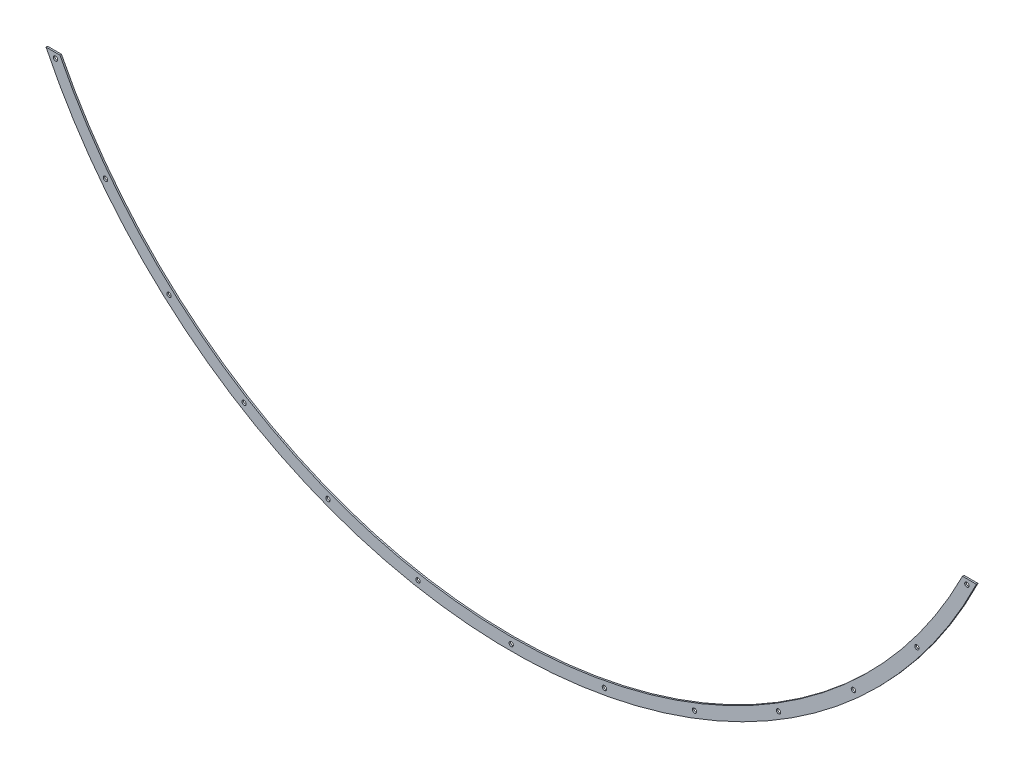
ISO-10303-21;
HEADER;
FILE_DESCRIPTION(('STEP AP214'),'2;1');
FILE_NAME('part.step','',(''),(''),'','','');
FILE_SCHEMA(('AUTOMOTIVE_DESIGN { 1 0 10303 214 1 1 1 1 }'));
ENDSEC;
DATA;
#1=APPLICATION_CONTEXT('core data for automotive mechanical design processes');
#2=APPLICATION_PROTOCOL_DEFINITION('international standard','automotive_design',2000,#1);
#3=PRODUCT_CONTEXT('',#1,'mechanical');
#4=PRODUCT('Part','Part','',(#3));
#5=PRODUCT_RELATED_PRODUCT_CATEGORY('part','',(#4));
#6=PRODUCT_DEFINITION_FORMATION('','',#4);
#7=PRODUCT_DEFINITION_CONTEXT('part definition',#1,'design');
#8=PRODUCT_DEFINITION('design','',#6,#7);
#9=PRODUCT_DEFINITION_SHAPE('','',#8);
#10=(LENGTH_UNIT() NAMED_UNIT(*) SI_UNIT(.MILLI.,.METRE.));
#11=(NAMED_UNIT(*) PLANE_ANGLE_UNIT() SI_UNIT($,.RADIAN.));
#12=(NAMED_UNIT(*) SI_UNIT($,.STERADIAN.) SOLID_ANGLE_UNIT());
#13=UNCERTAINTY_MEASURE_WITH_UNIT(LENGTH_MEASURE(1.E-05),#10,'distance_accuracy_value','');
#14=(GEOMETRIC_REPRESENTATION_CONTEXT(3) GLOBAL_UNCERTAINTY_ASSIGNED_CONTEXT((#13)) GLOBAL_UNIT_ASSIGNED_CONTEXT((#10,
#11,#12)) REPRESENTATION_CONTEXT('',''));
#15=CARTESIAN_POINT('',(0.,0.,0.));
#16=DIRECTION('',(0.,0.,1.));
#17=DIRECTION('',(1.,0.,0.));
#18=AXIS2_PLACEMENT_3D('',#15,#16,#17);
#19=CARTESIAN_POINT('',(0.,-364.000000000005,-1.11022302462516E-13));
#20=DIRECTION('',(0.,-1.00000000000001,0.));
#21=DIRECTION('',(1.,0.,0.));
#22=AXIS2_PLACEMENT_3D('',#19,#20,#21);
#23=PLANE('',#22);
#24=DIRECTION('',(0.,0.,1.00000000000001));
#25=VECTOR('',#24,1.);
#26=CARTESIAN_POINT('',(723.604864549705,-364.000000000005,-10.0000000000003));
#27=LINE('',#26,#25);
#28=CARTESIAN_POINT('',(723.604864549705,-364.000000000005,-1.66533453693773E-13));
#29=VERTEX_POINT('',#28);
#30=CARTESIAN_POINT('',(723.604864549705,-364.000000000004,-2.50000000000034));
#31=VERTEX_POINT('',#30);
#32=EDGE_CURVE('E11',#29,#31,#27,.F.);
#33=ORIENTED_EDGE('',*,*,#32,.F.);
#34=DIRECTION('',(1.,0.,0.));
#35=VECTOR('',#34,1.);
#36=CARTESIAN_POINT('',(0.,-364.000000000005,-1.11022302462516E-13));
#37=LINE('',#36,#35);
#38=CARTESIAN_POINT('',(745.924929198641,-364.000000000004,-4.9960036108132E-13));
#39=VERTEX_POINT('',#38);
#40=EDGE_CURVE('E89',#29,#39,#37,.T.);
#41=ORIENTED_EDGE('',*,*,#40,.T.);
#42=DIRECTION('',(0.,0.,1.00000000000001));
#43=VECTOR('',#42,1.);
#44=CARTESIAN_POINT('',(745.924929198641,-364.000000000004,-4.9960036108132E-13));
#45=LINE('',#44,#43);
#46=CARTESIAN_POINT('',(745.924929198641,-364.000000000004,-2.50000000000072));
#47=VERTEX_POINT('',#46);
#48=EDGE_CURVE('E109',#39,#47,#45,.F.);
#49=ORIENTED_EDGE('',*,*,#48,.T.);
#50=DIRECTION('',(1.,0.,0.));
#51=VECTOR('',#50,1.);
#52=CARTESIAN_POINT('',(0.,-364.000000000005,-2.50000000000028));
#53=LINE('',#52,#51);
#54=EDGE_CURVE('E91',#31,#47,#53,.T.);
#55=ORIENTED_EDGE('',*,*,#54,.F.);
#56=EDGE_LOOP('',(#33,#41,#49,#55));
#57=FACE_BOUND('',#56,.T.);
#58=ADVANCED_FACE('F38',(#57),#23,.F.);
#59=CARTESIAN_POINT('',(0.,-1.66533453693773E-13,-2.49999999999972));
#60=DIRECTION('',(0.,0.,1.00000000000001));
#61=DIRECTION('',(1.,0.,0.));
#62=AXIS2_PLACEMENT_3D('',#59,#60,#61);
#63=CYLINDRICAL_SURFACE('',#62,830.);
#64=CARTESIAN_POINT('',(0.,-1.66533453693773E-13,-2.49999999999972));
#65=DIRECTION('',(0.,0.,1.00000000000001));
#66=DIRECTION('',(1.,0.,0.));
#67=AXIS2_PLACEMENT_3D('',#64,#65,#66);
#68=CIRCLE('',#67,830.);
#69=CARTESIAN_POINT('',(-745.924929198645,-364.000000000005,-2.49999999999972));
#70=VERTEX_POINT('',#69);
#71=EDGE_CURVE('E120',#70,#47,#68,.T.);
#72=ORIENTED_EDGE('',*,*,#71,.T.);
#73=ORIENTED_EDGE('',*,*,#48,.F.);
#74=CARTESIAN_POINT('',(0.,0.,0.));
#75=DIRECTION('',(0.,0.,1.00000000000001));
#76=DIRECTION('',(1.,0.,0.));
#77=AXIS2_PLACEMENT_3D('',#74,#75,#76);
#78=CIRCLE('',#77,830.);
#79=CARTESIAN_POINT('',(-745.924929198645,-364.000000000005,2.22044604925031E-13));
#80=VERTEX_POINT('',#79);
#81=EDGE_CURVE('E95',#80,#39,#78,.T.);
#82=ORIENTED_EDGE('',*,*,#81,.F.);
#83=DIRECTION('',(0.,0.,1.00000000000001));
#84=VECTOR('',#83,1.);
#85=CARTESIAN_POINT('',(-745.924929198645,-364.000000000005,2.22044604925031E-13));
#86=LINE('',#85,#84);
#87=EDGE_CURVE('E62',#80,#70,#86,.F.);
#88=ORIENTED_EDGE('',*,*,#87,.T.);
#89=EDGE_LOOP('',(#72,#73,#82,#88));
#90=FACE_BOUND('',#89,.T.);
#91=ADVANCED_FACE('F40',(#90),#63,.T.);
#92=CARTESIAN_POINT('',(0.,-1.66533453693773E-13,-2.49999999999972));
#93=DIRECTION('',(0.,0.,1.00000000000001));
#94=DIRECTION('',(1.,0.,0.));
#95=AXIS2_PLACEMENT_3D('',#92,#93,#94);
#96=PLANE('',#95);
#97=CARTESIAN_POINT('',(293.861718627147,-765.535949727714,-2.5000000000005));
#98=DIRECTION('',(0.,0.,-1.00000000000001));
#99=DIRECTION('',(-0.933580426497203,-0.358367949545305,0.));
#100=AXIS2_PLACEMENT_3D('',#97,#98,#99);
#101=CIRCLE('',#100,3.50000000000001);
#102=CARTESIAN_POINT('',(290.594187134407,-766.790237551122,-2.5000000000005));
#103=VERTEX_POINT('',#102);
#104=EDGE_CURVE('E136',#103,#103,#101,.T.);
#105=ORIENTED_EDGE('',*,*,#104,.F.);
#106=EDGE_LOOP('',(#105));
#107=FACE_BOUND('',#106,.T.);
#108=CARTESIAN_POINT('',(428.448823067079,-699.164934770364,-2.50000000000039));
#109=DIRECTION('',(0.,0.,-1.00000000000001));
#110=DIRECTION('',(-0.852640164354092,-0.522498564715955,0.));
#111=AXIS2_PLACEMENT_3D('',#108,#109,#110);
#112=CIRCLE('',#111,3.50000000000001);
#113=CARTESIAN_POINT('',(425.46458249184,-700.99367974687,-2.50000000000039));
#114=VERTEX_POINT('',#113);
#115=EDGE_CURVE('E164',#114,#114,#112,.T.);
#116=ORIENTED_EDGE('',*,*,#115,.F.);
#117=EDGE_LOOP('',(#116));
#118=FACE_BOUND('',#117,.T.);
#119=CARTESIAN_POINT('',(548.687097214264,-609.378756891469,-2.49999999999972));
#120=DIRECTION('',(0.,0.,-1.00000000000001));
#121=DIRECTION('',(-0.743144825477393,-0.669130606358868,0.));
#122=AXIS2_PLACEMENT_3D('',#119,#120,#121);
#123=CIRCLE('',#122,3.50000000000001);
#124=CARTESIAN_POINT('',(546.086090325093,-611.720714013725,-2.49999999999973));
#125=VERTEX_POINT('',#124);
#126=EDGE_CURVE('E161',#125,#125,#123,.T.);
#127=ORIENTED_EDGE('',*,*,#126,.F.);
#128=EDGE_LOOP('',(#127));
#129=FACE_BOUND('',#128,.T.);
#130=CARTESIAN_POINT('',(650.549739038815,-499.184371787156,-2.50000000000017));
#131=DIRECTION('',(0.,0.,-1.00000000000001));
#132=DIRECTION('',(-0.60876142900872,-0.793353340291246,0.));
#133=AXIS2_PLACEMENT_3D('',#130,#131,#132);
#134=CIRCLE('',#133,3.50000000000001);
#135=CARTESIAN_POINT('',(648.419074037284,-501.961108478176,-2.50000000000017));
#136=VERTEX_POINT('',#135);
#137=EDGE_CURVE('E158',#136,#136,#134,.T.);
#138=ORIENTED_EDGE('',*,*,#137,.F.);
#139=EDGE_LOOP('',(#138));
#140=FACE_BOUND('',#139,.T.);
#141=CARTESIAN_POINT('',(730.62534983446,-372.272209786432,-2.50000000000045));
#142=DIRECTION('',(0.,0.,-1.00000000000001));
#143=DIRECTION('',(-0.453990499739545,-0.891006524188379,0.));
#144=AXIS2_PLACEMENT_3D('',#141,#142,#143);
#145=CIRCLE('',#144,3.50000000000001);
#146=CARTESIAN_POINT('',(729.036383085372,-375.390732621091,-2.50000000000045));
#147=VERTEX_POINT('',#146);
#148=EDGE_CURVE('E155',#147,#147,#145,.T.);
#149=ORIENTED_EDGE('',*,*,#148,.F.);
#150=EDGE_LOOP('',(#149));
#151=FACE_BOUND('',#150,.T.);
#152=CARTESIAN_POINT('',(-149.433130903561,-806.269024202452,-2.50000000000111));
#153=DIRECTION('',(0.,0.,-1.00000000000001));
#154=DIRECTION('',(-0.983254907563953,0.18223552549215,0.));
#155=AXIS2_PLACEMENT_3D('',#152,#153,#154);
#156=CIRCLE('',#155,3.50000000000001);
#157=CARTESIAN_POINT('',(-152.874523080035,-805.63119986323,-2.50000000000111));
#158=VERTEX_POINT('',#157);
#159=EDGE_CURVE('E152',#158,#158,#156,.T.);
#160=ORIENTED_EDGE('',*,*,#159,.F.);
#161=EDGE_LOOP('',(#160));
#162=FACE_BOUND('',#161,.T.);
#163=CARTESIAN_POINT('',(-293.861718627147,-765.535949727713,-2.50000000000022));
#164=DIRECTION('',(0.,0.,-1.00000000000001));
#165=DIRECTION('',(-0.9335804264972,0.358367949545305,0.));
#166=AXIS2_PLACEMENT_3D('',#163,#164,#165);
#167=CIRCLE('',#166,3.50000000000001);
#168=CARTESIAN_POINT('',(-297.129250119887,-764.281661904305,-2.50000000000022));
#169=VERTEX_POINT('',#168);
#170=EDGE_CURVE('E149',#169,#169,#167,.T.);
#171=ORIENTED_EDGE('',*,*,#170,.F.);
#172=EDGE_LOOP('',(#171));
#173=FACE_BOUND('',#172,.T.);
#174=CARTESIAN_POINT('',(-428.448823067078,-699.164934770364,-2.49999999999967));
#175=DIRECTION('',(0.,0.,-1.00000000000001));
#176=DIRECTION('',(-0.852640164354092,0.522498564715957,0.));
#177=AXIS2_PLACEMENT_3D('',#174,#175,#176);
#178=CIRCLE('',#177,3.50000000000001);
#179=CARTESIAN_POINT('',(-431.433063642318,-697.336189793858,-2.49999999999967));
#180=VERTEX_POINT('',#179);
#181=EDGE_CURVE('E146',#180,#180,#178,.T.);
#182=ORIENTED_EDGE('',*,*,#181,.F.);
#183=EDGE_LOOP('',(#182));
#184=FACE_BOUND('',#183,.T.);
#185=CARTESIAN_POINT('',(-548.687097214266,-609.378756891471,-2.5000000000005));
#186=DIRECTION('',(0.,0.,-1.00000000000001));
#187=DIRECTION('',(-0.743144825477393,0.669130606358868,0.));
#188=AXIS2_PLACEMENT_3D('',#185,#186,#187);
#189=CIRCLE('',#188,3.50000000000001);
#190=CARTESIAN_POINT('',(-551.288104103436,-607.036799769215,-2.5000000000005));
#191=VERTEX_POINT('',#190);
#192=EDGE_CURVE('E143',#191,#191,#189,.T.);
#193=ORIENTED_EDGE('',*,*,#192,.F.);
#194=EDGE_LOOP('',(#193));
#195=FACE_BOUND('',#194,.T.);
#196=CARTESIAN_POINT('',(-650.549739038813,-499.184371787157,-2.49999999999972));
#197=DIRECTION('',(0.,0.,-1.00000000000001));
#198=DIRECTION('',(-0.608761429008718,0.793353340291247,0.));
#199=AXIS2_PLACEMENT_3D('',#196,#197,#198);
#200=CIRCLE('',#199,3.50000000000001);
#201=CARTESIAN_POINT('',(-652.680404040344,-496.407635096138,-2.49999999999973));
#202=VERTEX_POINT('',#201);
#203=EDGE_CURVE('E140',#202,#202,#200,.T.);
#204=ORIENTED_EDGE('',*,*,#203,.F.);
#205=EDGE_LOOP('',(#204));
#206=FACE_BOUND('',#205,.T.);
#207=CARTESIAN_POINT('',(-730.625349834465,-372.272209786431,-2.50000000000106));
#208=DIRECTION('',(0.,0.,-1.00000000000001));
#209=DIRECTION('',(-0.453990499739545,0.89100652418838,0.));
#210=AXIS2_PLACEMENT_3D('',#207,#208,#209);
#211=CIRCLE('',#210,3.50000000000001);
#212=CARTESIAN_POINT('',(-732.214316583554,-369.153686951772,-2.50000000000106));
#213=VERTEX_POINT('',#212);
#214=EDGE_CURVE('E137',#213,#213,#211,.T.);
#215=ORIENTED_EDGE('',*,*,#214,.F.);
#216=EDGE_LOOP('',(#215));
#217=FACE_BOUND('',#216,.T.);
#218=CARTESIAN_POINT('',(149.433130903562,-806.269024202452,-2.49999999999961));
#219=DIRECTION('',(0.,0.,-1.00000000000001));
#220=DIRECTION('',(-0.983254907563956,-0.18223552549215,0.));
#221=AXIS2_PLACEMENT_3D('',#218,#219,#220);
#222=CIRCLE('',#221,3.50000000000001);
#223=CARTESIAN_POINT('',(145.991738727088,-806.906848541675,-2.49999999999961));
#224=VERTEX_POINT('',#223);
#225=EDGE_CURVE('E132',#224,#224,#222,.T.);
#226=ORIENTED_EDGE('',*,*,#225,.F.);
#227=EDGE_LOOP('',(#226));
#228=FACE_BOUND('',#227,.T.);
#229=CARTESIAN_POINT('',(1.73472347597681E-13,-820.00000000001,-2.50000000000017));
#230=DIRECTION('',(0.,0.,-1.00000000000001));
#231=DIRECTION('',(-1.,0.,0.));
#232=AXIS2_PLACEMENT_3D('',#229,#230,#231);
#233=CIRCLE('',#232,3.50000000000001);
#234=CARTESIAN_POINT('',(-3.49999999999983,-820.00000000001,-2.50000000000017));
#235=VERTEX_POINT('',#234);
#236=EDGE_CURVE('E129',#235,#235,#233,.T.);
#237=ORIENTED_EDGE('',*,*,#236,.F.);
#238=EDGE_LOOP('',(#237));
#239=FACE_BOUND('',#238,.T.);
#240=CARTESIAN_POINT('',(-723.604864549709,-364.000000000005,-2.50000000000117));
#241=VERTEX_POINT('',#240);
#242=EDGE_CURVE('E113',#70,#241,#53,.T.);
#243=ORIENTED_EDGE('',*,*,#242,.T.);
#244=CARTESIAN_POINT('',(0.,-1.66533453693773E-13,-2.49999999999972));
#245=DIRECTION('',(0.,0.,1.00000000000001));
#246=DIRECTION('',(1.,0.,0.));
#247=AXIS2_PLACEMENT_3D('',#244,#245,#246);
#248=CIRCLE('',#247,810.);
#249=EDGE_CURVE('E54',#241,#31,#248,.T.);
#250=ORIENTED_EDGE('',*,*,#249,.T.);
#251=ORIENTED_EDGE('',*,*,#54,.T.);
#252=ORIENTED_EDGE('',*,*,#71,.F.);
#253=EDGE_LOOP('',(#243,#250,#251,#252));
#254=FACE_BOUND('',#253,.T.);
#255=ADVANCED_FACE('F118',(#107,#118,#129,#140,#151,#162,#173,#184,#195,#206,#217,#228,#239,
#254),#96,.F.);
#256=CARTESIAN_POINT('',(0.,0.,0.));
#257=DIRECTION('',(0.,0.,1.00000000000001));
#258=DIRECTION('',(1.,0.,0.));
#259=AXIS2_PLACEMENT_3D('',#256,#257,#258);
#260=PLANE('',#259);
#261=CARTESIAN_POINT('',(293.861718627147,-765.535949727715,-3.33066907387547E-13));
#262=DIRECTION('',(0.,0.,1.00000000000001));
#263=DIRECTION('',(1.,0.,0.));
#264=AXIS2_PLACEMENT_3D('',#261,#262,#263);
#265=CIRCLE('',#264,3.50000000000001);
#266=CARTESIAN_POINT('',(297.361718627147,-765.535949727715,-3.33066907387547E-13));
#267=VERTEX_POINT('',#266);
#268=EDGE_CURVE('E42',#267,#267,#265,.T.);
#269=ORIENTED_EDGE('',*,*,#268,.F.);
#270=EDGE_LOOP('',(#269));
#271=FACE_BOUND('',#270,.T.);
#272=CARTESIAN_POINT('',(428.448823067079,-699.164934770365,-2.22044604925031E-13));
#273=DIRECTION('',(0.,0.,1.00000000000001));
#274=DIRECTION('',(1.,0.,0.));
#275=AXIS2_PLACEMENT_3D('',#272,#273,#274);
#276=CIRCLE('',#275,3.50000000000001);
#277=CARTESIAN_POINT('',(431.948823067079,-699.164934770365,-2.22044604925031E-13));
#278=VERTEX_POINT('',#277);
#279=EDGE_CURVE('E232',#278,#278,#276,.T.);
#280=ORIENTED_EDGE('',*,*,#279,.F.);
#281=EDGE_LOOP('',(#280));
#282=FACE_BOUND('',#281,.T.);
#283=CARTESIAN_POINT('',(548.687097214264,-609.378756891471,-2.22044604925031E-13));
#284=DIRECTION('',(0.,0.,1.00000000000001));
#285=DIRECTION('',(1.,0.,0.));
#286=AXIS2_PLACEMENT_3D('',#283,#284,#285);
#287=CIRCLE('',#286,3.50000000000001);
#288=CARTESIAN_POINT('',(552.187097214264,-609.378756891471,-2.22044604925031E-13));
#289=VERTEX_POINT('',#288);
#290=EDGE_CURVE('E236',#289,#289,#287,.T.);
#291=ORIENTED_EDGE('',*,*,#290,.F.);
#292=EDGE_LOOP('',(#291));
#293=FACE_BOUND('',#292,.T.);
#294=CARTESIAN_POINT('',(650.549739038815,-499.184371787156,-1.66533453693773E-13));
#295=DIRECTION('',(0.,0.,1.00000000000001));
#296=DIRECTION('',(1.,0.,0.));
#297=AXIS2_PLACEMENT_3D('',#294,#295,#296);
#298=CIRCLE('',#297,3.50000000000001);
#299=CARTESIAN_POINT('',(654.049739038815,-499.184371787156,-1.66533453693773E-13));
#300=VERTEX_POINT('',#299);
#301=EDGE_CURVE('E240',#300,#300,#298,.T.);
#302=ORIENTED_EDGE('',*,*,#301,.F.);
#303=EDGE_LOOP('',(#302));
#304=FACE_BOUND('',#303,.T.);
#305=CARTESIAN_POINT('',(730.62534983446,-372.272209786432,-6.10622663543836E-13));
#306=DIRECTION('',(0.,0.,1.00000000000001));
#307=DIRECTION('',(1.,0.,0.));
#308=AXIS2_PLACEMENT_3D('',#305,#306,#307);
#309=CIRCLE('',#308,3.50000000000001);
#310=CARTESIAN_POINT('',(734.12534983446,-372.272209786432,-6.10622663543836E-13));
#311=VERTEX_POINT('',#310);
#312=EDGE_CURVE('E244',#311,#311,#309,.T.);
#313=ORIENTED_EDGE('',*,*,#312,.F.);
#314=EDGE_LOOP('',(#313));
#315=FACE_BOUND('',#314,.T.);
#316=CARTESIAN_POINT('',(-149.433130903561,-806.269024202453,-1.22124532708767E-12));
#317=DIRECTION('',(0.,0.,1.00000000000001));
#318=DIRECTION('',(1.,0.,0.));
#319=AXIS2_PLACEMENT_3D('',#316,#317,#318);
#320=CIRCLE('',#319,3.50000000000001);
#321=CARTESIAN_POINT('',(-145.933130903561,-806.269024202453,-1.22124532708767E-12));
#322=VERTEX_POINT('',#321);
#323=EDGE_CURVE('E248',#322,#322,#320,.T.);
#324=ORIENTED_EDGE('',*,*,#323,.F.);
#325=EDGE_LOOP('',(#324));
#326=FACE_BOUND('',#325,.T.);
#327=CARTESIAN_POINT('',(-293.861718627147,-765.535949727714,9.99200722162641E-13));
#328=DIRECTION('',(0.,0.,1.00000000000001));
#329=DIRECTION('',(1.,0.,0.));
#330=AXIS2_PLACEMENT_3D('',#327,#328,#329);
#331=CIRCLE('',#330,3.50000000000001);
#332=CARTESIAN_POINT('',(-290.361718627147,-765.535949727714,9.99200722162641E-13));
#333=VERTEX_POINT('',#332);
#334=EDGE_CURVE('E252',#333,#333,#331,.T.);
#335=ORIENTED_EDGE('',*,*,#334,.F.);
#336=EDGE_LOOP('',(#335));
#337=FACE_BOUND('',#336,.T.);
#338=CARTESIAN_POINT('',(-428.448823067079,-699.164934770364,-2.77555756156289E-13));
#339=DIRECTION('',(0.,0.,1.00000000000001));
#340=DIRECTION('',(1.,0.,0.));
#341=AXIS2_PLACEMENT_3D('',#338,#339,#340);
#342=CIRCLE('',#341,3.50000000000001);
#343=CARTESIAN_POINT('',(-424.948823067079,-699.164934770364,-2.77555756156289E-13));
#344=VERTEX_POINT('',#343);
#345=EDGE_CURVE('E256',#344,#344,#342,.T.);
#346=ORIENTED_EDGE('',*,*,#345,.F.);
#347=EDGE_LOOP('',(#346));
#348=FACE_BOUND('',#347,.T.);
#349=CARTESIAN_POINT('',(-548.687097214265,-609.37875689147,-6.10622663543836E-13));
#350=DIRECTION('',(0.,0.,1.00000000000001));
#351=DIRECTION('',(1.,0.,0.));
#352=AXIS2_PLACEMENT_3D('',#349,#350,#351);
#353=CIRCLE('',#352,3.50000000000001);
#354=CARTESIAN_POINT('',(-545.187097214265,-609.37875689147,-6.10622663543836E-13));
#355=VERTEX_POINT('',#354);
#356=EDGE_CURVE('E260',#355,#355,#353,.T.);
#357=ORIENTED_EDGE('',*,*,#356,.F.);
#358=EDGE_LOOP('',(#357));
#359=FACE_BOUND('',#358,.T.);
#360=CARTESIAN_POINT('',(-650.549739038813,-499.184371787158,2.22044604925031E-13));
#361=DIRECTION('',(0.,0.,1.00000000000001));
#362=DIRECTION('',(1.,0.,0.));
#363=AXIS2_PLACEMENT_3D('',#360,#361,#362);
#364=CIRCLE('',#363,3.50000000000001);
#365=CARTESIAN_POINT('',(-647.049739038813,-499.184371787158,2.22044604925031E-13));
#366=VERTEX_POINT('',#365);
#367=EDGE_CURVE('E264',#366,#366,#364,.T.);
#368=ORIENTED_EDGE('',*,*,#367,.F.);
#369=EDGE_LOOP('',(#368));
#370=FACE_BOUND('',#369,.T.);
#371=CARTESIAN_POINT('',(-730.625349834465,-372.272209786431,1.11022302462516E-13));
#372=DIRECTION('',(0.,0.,1.00000000000001));
#373=DIRECTION('',(1.,0.,0.));
#374=AXIS2_PLACEMENT_3D('',#371,#372,#373);
#375=CIRCLE('',#374,3.50000000000001);
#376=CARTESIAN_POINT('',(-727.125349834465,-372.272209786431,1.11022302462516E-13));
#377=VERTEX_POINT('',#376);
#378=EDGE_CURVE('E268',#377,#377,#375,.T.);
#379=ORIENTED_EDGE('',*,*,#378,.F.);
#380=EDGE_LOOP('',(#379));
#381=FACE_BOUND('',#380,.T.);
#382=CARTESIAN_POINT('',(149.433130903561,-806.269024202453,1.22124532708767E-12));
#383=DIRECTION('',(0.,0.,1.00000000000001));
#384=DIRECTION('',(1.,0.,0.));
#385=AXIS2_PLACEMENT_3D('',#382,#383,#384);
#386=CIRCLE('',#385,3.50000000000001);
#387=CARTESIAN_POINT('',(152.933130903561,-806.269024202453,1.22124532708767E-12));
#388=VERTEX_POINT('',#387);
#389=EDGE_CURVE('E135',#388,#388,#386,.T.);
#390=ORIENTED_EDGE('',*,*,#389,.F.);
#391=EDGE_LOOP('',(#390));
#392=FACE_BOUND('',#391,.T.);
#393=CARTESIAN_POINT('',(1.40512601554121E-13,-820.00000000001,1.11022302462516E-13));
#394=DIRECTION('',(0.,0.,1.00000000000001));
#395=DIRECTION('',(1.,0.,0.));
#396=AXIS2_PLACEMENT_3D('',#393,#394,#395);
#397=CIRCLE('',#396,3.50000000000001);
#398=CARTESIAN_POINT('',(3.50000000000015,-820.00000000001,1.11022302462516E-13));
#399=VERTEX_POINT('',#398);
#400=EDGE_CURVE('E84',#399,#399,#397,.T.);
#401=ORIENTED_EDGE('',*,*,#400,.F.);
#402=EDGE_LOOP('',(#401));
#403=FACE_BOUND('',#402,.T.);
#404=CARTESIAN_POINT('',(0.,0.,0.));
#405=DIRECTION('',(0.,0.,1.00000000000001));
#406=DIRECTION('',(1.,0.,0.));
#407=AXIS2_PLACEMENT_3D('',#404,#405,#406);
#408=CIRCLE('',#407,810.);
#409=CARTESIAN_POINT('',(-723.604864549709,-364.000000000006,-6.66133814775094E-13));
#410=VERTEX_POINT('',#409);
#411=EDGE_CURVE('E79',#410,#29,#408,.T.);
#412=ORIENTED_EDGE('',*,*,#411,.F.);
#413=EDGE_CURVE('E96',#80,#410,#37,.T.);
#414=ORIENTED_EDGE('',*,*,#413,.F.);
#415=ORIENTED_EDGE('',*,*,#81,.T.);
#416=ORIENTED_EDGE('',*,*,#40,.F.);
#417=EDGE_LOOP('',(#412,#414,#415,#416));
#418=FACE_BOUND('',#417,.T.);
#419=ADVANCED_FACE('F93',(#271,#282,#293,#304,#315,#326,#337,#348,#359,#370,#381,#392,#403,
#418),#260,.T.);
#420=DIRECTION('',(0.,0.,1.00000000000001));
#421=VECTOR('',#420,1.);
#422=CARTESIAN_POINT('',(-723.60486454971,-364.000000000005,-10.0000000000008));
#423=LINE('',#422,#421);
#424=EDGE_CURVE('E47',#241,#410,#423,.T.);
#425=ORIENTED_EDGE('',*,*,#424,.F.);
#426=ORIENTED_EDGE('',*,*,#242,.F.);
#427=ORIENTED_EDGE('',*,*,#87,.F.);
#428=ORIENTED_EDGE('',*,*,#413,.T.);
#429=EDGE_LOOP('',(#425,#426,#427,#428));
#430=FACE_BOUND('',#429,.T.);
#431=ADVANCED_FACE('F211',(#430),#23,.F.);
#432=CARTESIAN_POINT('',(0.,-6.38378239159465E-13,-10.0000000000003));
#433=DIRECTION('',(0.,0.,1.00000000000001));
#434=DIRECTION('',(1.,0.,0.));
#435=AXIS2_PLACEMENT_3D('',#432,#433,#434);
#436=CYLINDRICAL_SURFACE('',#435,810.);
#437=ORIENTED_EDGE('',*,*,#424,.T.);
#438=ORIENTED_EDGE('',*,*,#411,.T.);
#439=ORIENTED_EDGE('',*,*,#32,.T.);
#440=ORIENTED_EDGE('',*,*,#249,.F.);
#441=EDGE_LOOP('',(#437,#438,#439,#440));
#442=FACE_BOUND('',#441,.T.);
#443=ADVANCED_FACE('F81',(#442),#436,.F.);
#444=CARTESIAN_POINT('',(1.52655665885959E-13,-820.00000000001,7.50000000000006));
#445=DIRECTION('',(0.,0.,-1.00000000000001));
#446=DIRECTION('',(-1.,0.,0.));
#447=AXIS2_PLACEMENT_3D('',#444,#445,#446);
#448=CYLINDRICAL_SURFACE('',#447,3.50000000000001);
#449=ORIENTED_EDGE('',*,*,#400,.T.);
#450=EDGE_LOOP('',(#449));
#451=FACE_BOUND('',#450,.T.);
#452=ORIENTED_EDGE('',*,*,#236,.T.);
#453=EDGE_LOOP('',(#452));
#454=FACE_BOUND('',#453,.T.);
#455=ADVANCED_FACE('F199',(#451,#454),#448,.F.);
#456=CARTESIAN_POINT('',(149.433130903561,-806.269024202453,7.5000000000004));
#457=DIRECTION('',(0.,0.,-1.00000000000001));
#458=DIRECTION('',(-1.,0.,0.));
#459=AXIS2_PLACEMENT_3D('',#456,#457,#458);
#460=CYLINDRICAL_SURFACE('',#459,3.50000000000001);
#461=ORIENTED_EDGE('',*,*,#389,.T.);
#462=EDGE_LOOP('',(#461));
#463=FACE_BOUND('',#462,.T.);
#464=ORIENTED_EDGE('',*,*,#225,.T.);
#465=EDGE_LOOP('',(#464));
#466=FACE_BOUND('',#465,.T.);
#467=ADVANCED_FACE('F201',(#463,#466),#460,.F.);
#468=CARTESIAN_POINT('',(-730.625349834465,-372.272209786431,7.49999999999951));
#469=DIRECTION('',(0.,0.,-1.00000000000001));
#470=DIRECTION('',(-1.,0.,0.));
#471=AXIS2_PLACEMENT_3D('',#468,#469,#470);
#472=CYLINDRICAL_SURFACE('',#471,3.50000000000001);
#473=ORIENTED_EDGE('',*,*,#378,.T.);
#474=EDGE_LOOP('',(#473));
#475=FACE_BOUND('',#474,.T.);
#476=ORIENTED_EDGE('',*,*,#214,.T.);
#477=EDGE_LOOP('',(#476));
#478=FACE_BOUND('',#477,.T.);
#479=ADVANCED_FACE('F208',(#475,#478),#472,.F.);
#480=CARTESIAN_POINT('',(-650.549739038813,-499.184371787157,7.50000000000001));
#481=DIRECTION('',(0.,0.,-1.00000000000001));
#482=DIRECTION('',(-1.,0.,0.));
#483=AXIS2_PLACEMENT_3D('',#480,#481,#482);
#484=CYLINDRICAL_SURFACE('',#483,3.50000000000001);
#485=ORIENTED_EDGE('',*,*,#367,.T.);
#486=EDGE_LOOP('',(#485));
#487=FACE_BOUND('',#486,.T.);
#488=ORIENTED_EDGE('',*,*,#203,.T.);
#489=EDGE_LOOP('',(#488));
#490=FACE_BOUND('',#489,.T.);
#491=ADVANCED_FACE('F321',(#487,#490),#484,.F.);
#492=CARTESIAN_POINT('',(-548.687097214265,-609.378756891471,7.49999999999973));
#493=DIRECTION('',(0.,0.,-1.00000000000001));
#494=DIRECTION('',(-1.,0.,0.));
#495=AXIS2_PLACEMENT_3D('',#492,#493,#494);
#496=CYLINDRICAL_SURFACE('',#495,3.50000000000001);
#497=ORIENTED_EDGE('',*,*,#356,.T.);
#498=EDGE_LOOP('',(#497));
#499=FACE_BOUND('',#498,.T.);
#500=ORIENTED_EDGE('',*,*,#192,.T.);
#501=EDGE_LOOP('',(#500));
#502=FACE_BOUND('',#501,.T.);
#503=ADVANCED_FACE('F317',(#499,#502),#496,.F.);
#504=CARTESIAN_POINT('',(-428.448823067079,-699.164934770366,7.50000000000051));
#505=DIRECTION('',(0.,0.,-1.00000000000001));
#506=DIRECTION('',(-1.,0.,0.));
#507=AXIS2_PLACEMENT_3D('',#504,#505,#506);
#508=CYLINDRICAL_SURFACE('',#507,3.50000000000001);
#509=ORIENTED_EDGE('',*,*,#345,.T.);
#510=EDGE_LOOP('',(#509));
#511=FACE_BOUND('',#510,.T.);
#512=ORIENTED_EDGE('',*,*,#181,.T.);
#513=EDGE_LOOP('',(#512));
#514=FACE_BOUND('',#513,.T.);
#515=ADVANCED_FACE('F313',(#511,#514),#508,.F.);
#516=CARTESIAN_POINT('',(-293.861718627147,-765.535949727714,7.50000000000051));
#517=DIRECTION('',(0.,0.,-1.00000000000001));
#518=DIRECTION('',(-1.,0.,0.));
#519=AXIS2_PLACEMENT_3D('',#516,#517,#518);
#520=CYLINDRICAL_SURFACE('',#519,3.50000000000001);
#521=ORIENTED_EDGE('',*,*,#334,.T.);
#522=EDGE_LOOP('',(#521));
#523=FACE_BOUND('',#522,.T.);
#524=ORIENTED_EDGE('',*,*,#170,.T.);
#525=EDGE_LOOP('',(#524));
#526=FACE_BOUND('',#525,.T.);
#527=ADVANCED_FACE('F309',(#523,#526),#520,.F.);
#528=CARTESIAN_POINT('',(-149.433130903561,-806.269024202453,7.49999999999884));
#529=DIRECTION('',(0.,0.,-1.00000000000001));
#530=DIRECTION('',(-1.,0.,0.));
#531=AXIS2_PLACEMENT_3D('',#528,#529,#530);
#532=CYLINDRICAL_SURFACE('',#531,3.50000000000001);
#533=ORIENTED_EDGE('',*,*,#323,.T.);
#534=EDGE_LOOP('',(#533));
#535=FACE_BOUND('',#534,.T.);
#536=ORIENTED_EDGE('',*,*,#159,.T.);
#537=EDGE_LOOP('',(#536));
#538=FACE_BOUND('',#537,.T.);
#539=ADVANCED_FACE('F305',(#535,#538),#532,.F.);
#540=CARTESIAN_POINT('',(730.62534983446,-372.272209786432,7.49999999999951));
#541=DIRECTION('',(0.,0.,-1.00000000000001));
#542=DIRECTION('',(-1.,0.,0.));
#543=AXIS2_PLACEMENT_3D('',#540,#541,#542);
#544=CYLINDRICAL_SURFACE('',#543,3.50000000000001);
#545=ORIENTED_EDGE('',*,*,#312,.T.);
#546=EDGE_LOOP('',(#545));
#547=FACE_BOUND('',#546,.T.);
#548=ORIENTED_EDGE('',*,*,#148,.T.);
#549=EDGE_LOOP('',(#548));
#550=FACE_BOUND('',#549,.T.);
#551=ADVANCED_FACE('F301',(#547,#550),#544,.F.);
#552=CARTESIAN_POINT('',(650.549739038815,-499.184371787156,7.4999999999999));
#553=DIRECTION('',(0.,0.,-1.00000000000001));
#554=DIRECTION('',(-1.,0.,0.));
#555=AXIS2_PLACEMENT_3D('',#552,#553,#554);
#556=CYLINDRICAL_SURFACE('',#555,3.50000000000001);
#557=ORIENTED_EDGE('',*,*,#301,.T.);
#558=EDGE_LOOP('',(#557));
#559=FACE_BOUND('',#558,.T.);
#560=ORIENTED_EDGE('',*,*,#137,.T.);
#561=EDGE_LOOP('',(#560));
#562=FACE_BOUND('',#561,.T.);
#563=ADVANCED_FACE('F297',(#559,#562),#556,.F.);
#564=CARTESIAN_POINT('',(548.687097214264,-609.378756891471,7.50000000000023));
#565=DIRECTION('',(0.,0.,-1.00000000000001));
#566=DIRECTION('',(-1.,0.,0.));
#567=AXIS2_PLACEMENT_3D('',#564,#565,#566);
#568=CYLINDRICAL_SURFACE('',#567,3.50000000000001);
#569=ORIENTED_EDGE('',*,*,#290,.T.);
#570=EDGE_LOOP('',(#569));
#571=FACE_BOUND('',#570,.T.);
#572=ORIENTED_EDGE('',*,*,#126,.T.);
#573=EDGE_LOOP('',(#572));
#574=FACE_BOUND('',#573,.T.);
#575=ADVANCED_FACE('F292',(#571,#574),#568,.F.);
#576=CARTESIAN_POINT('',(428.448823067079,-699.164934770364,7.50000000000012));
#577=DIRECTION('',(0.,0.,-1.00000000000001));
#578=DIRECTION('',(-1.,0.,0.));
#579=AXIS2_PLACEMENT_3D('',#576,#577,#578);
#580=CYLINDRICAL_SURFACE('',#579,3.50000000000001);
#581=ORIENTED_EDGE('',*,*,#279,.T.);
#582=EDGE_LOOP('',(#581));
#583=FACE_BOUND('',#582,.T.);
#584=ORIENTED_EDGE('',*,*,#115,.T.);
#585=EDGE_LOOP('',(#584));
#586=FACE_BOUND('',#585,.T.);
#587=ADVANCED_FACE('F287',(#583,#586),#580,.F.);
#588=CARTESIAN_POINT('',(293.861718627147,-765.535949727715,7.49999999999962));
#589=DIRECTION('',(0.,0.,-1.00000000000001));
#590=DIRECTION('',(-1.,0.,0.));
#591=AXIS2_PLACEMENT_3D('',#588,#589,#590);
#592=CYLINDRICAL_SURFACE('',#591,3.50000000000001);
#593=ORIENTED_EDGE('',*,*,#268,.T.);
#594=EDGE_LOOP('',(#593));
#595=FACE_BOUND('',#594,.T.);
#596=ORIENTED_EDGE('',*,*,#104,.T.);
#597=EDGE_LOOP('',(#596));
#598=FACE_BOUND('',#597,.T.);
#599=ADVANCED_FACE('F170',(#595,#598),#592,.F.);
#600=CLOSED_SHELL('',(#58,#91,#255,#419,#431,#443,#455,#467,#479,#491,#503,#515,#527,#539,#551,
#563,#575,#587,#599));
#601=MANIFOLD_SOLID_BREP('B2',#600);
#602=ADVANCED_BREP_SHAPE_REPRESENTATION('',(#18,#601),#14);
#603=SHAPE_DEFINITION_REPRESENTATION(#9,#602);
ENDSEC;
END-ISO-10303-21;
